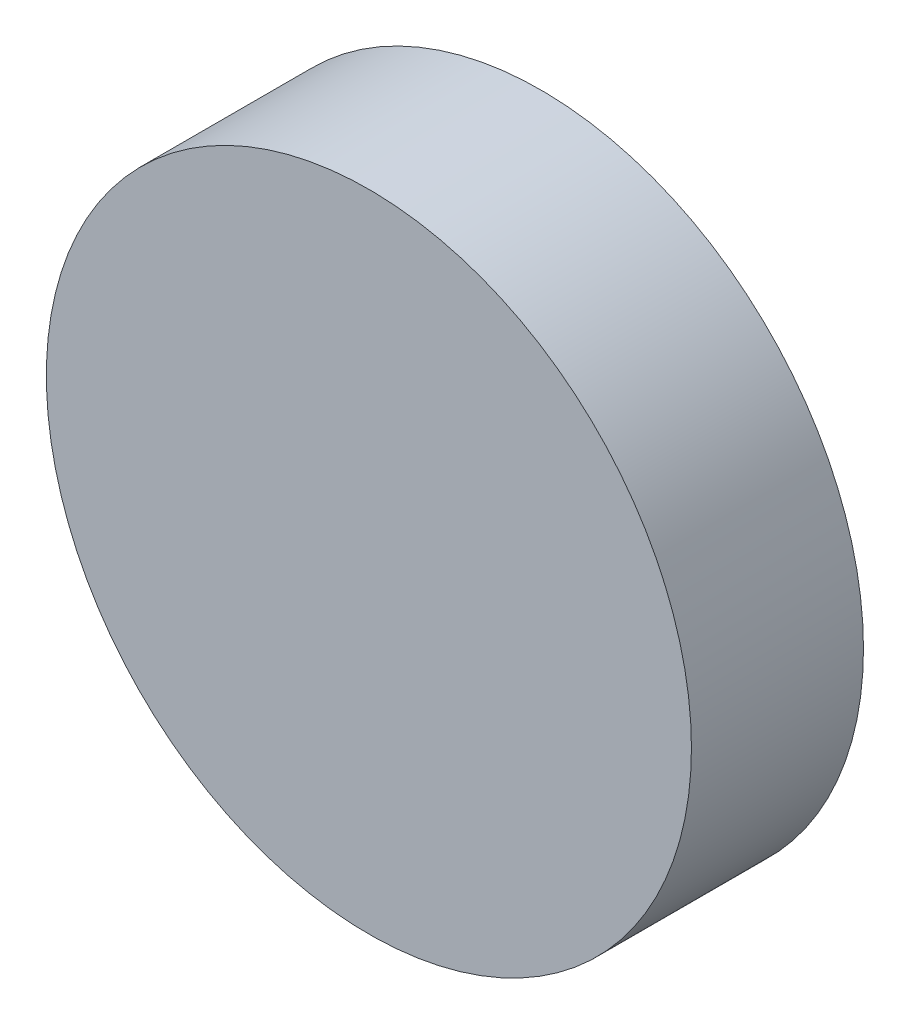
ISO-10303-21;
HEADER;
FILE_DESCRIPTION(('STEP AP214'),'2;1');
FILE_NAME('part.step','',(''),(''),'','','');
FILE_SCHEMA(('AUTOMOTIVE_DESIGN { 1 0 10303 214 1 1 1 1 }'));
ENDSEC;
DATA;
#1=APPLICATION_CONTEXT('core data for automotive mechanical design processes');
#2=APPLICATION_PROTOCOL_DEFINITION('international standard','automotive_design',2000,#1);
#3=PRODUCT_CONTEXT('',#1,'mechanical');
#4=PRODUCT('Part','Part','',(#3));
#5=PRODUCT_RELATED_PRODUCT_CATEGORY('part','',(#4));
#6=PRODUCT_DEFINITION_FORMATION('','',#4);
#7=PRODUCT_DEFINITION_CONTEXT('part definition',#1,'design');
#8=PRODUCT_DEFINITION('design','',#6,#7);
#9=PRODUCT_DEFINITION_SHAPE('','',#8);
#10=(LENGTH_UNIT() NAMED_UNIT(*) SI_UNIT(.MILLI.,.METRE.));
#11=(NAMED_UNIT(*) PLANE_ANGLE_UNIT() SI_UNIT($,.RADIAN.));
#12=(NAMED_UNIT(*) SI_UNIT($,.STERADIAN.) SOLID_ANGLE_UNIT());
#13=UNCERTAINTY_MEASURE_WITH_UNIT(LENGTH_MEASURE(1.E-05),#10,'distance_accuracy_value','');
#14=(GEOMETRIC_REPRESENTATION_CONTEXT(3) GLOBAL_UNCERTAINTY_ASSIGNED_CONTEXT((#13)) GLOBAL_UNIT_ASSIGNED_CONTEXT((#10,
#11,#12)) REPRESENTATION_CONTEXT('',''));
#15=CARTESIAN_POINT('',(0.,0.,0.));
#16=DIRECTION('',(0.,0.,1.));
#17=DIRECTION('',(1.,0.,0.));
#18=AXIS2_PLACEMENT_3D('',#15,#16,#17);
#19=CARTESIAN_POINT('',(0.,0.,8.));
#20=DIRECTION('',(0.,0.,-1.));
#21=DIRECTION('',(-1.,0.,0.));
#22=AXIS2_PLACEMENT_3D('',#19,#20,#21);
#23=CYLINDRICAL_SURFACE('',#22,15.);
#24=CARTESIAN_POINT('',(0.,0.,8.));
#25=DIRECTION('',(0.,0.,1.));
#26=DIRECTION('',(1.,0.,0.));
#27=AXIS2_PLACEMENT_3D('',#24,#25,#26);
#28=CIRCLE('',#27,15.);
#29=CARTESIAN_POINT('',(15.,0.,8.));
#30=VERTEX_POINT('',#29);
#31=EDGE_CURVE('E11',#30,#30,#28,.T.);
#32=ORIENTED_EDGE('',*,*,#31,.F.);
#33=EDGE_LOOP('',(#32));
#34=FACE_BOUND('',#33,.T.);
#35=CARTESIAN_POINT('',(0.,0.,0.));
#36=DIRECTION('',(0.,0.,1.));
#37=DIRECTION('',(1.,0.,0.));
#38=AXIS2_PLACEMENT_3D('',#35,#36,#37);
#39=CIRCLE('',#38,15.);
#40=CARTESIAN_POINT('',(15.,0.,0.));
#41=VERTEX_POINT('',#40);
#42=EDGE_CURVE('E36',#41,#41,#39,.T.);
#43=ORIENTED_EDGE('',*,*,#42,.T.);
#44=EDGE_LOOP('',(#43));
#45=FACE_BOUND('',#44,.T.);
#46=ADVANCED_FACE('F33',(#34,#45),#23,.T.);
#47=CARTESIAN_POINT('',(0.,0.,8.));
#48=DIRECTION('',(0.,0.,1.));
#49=DIRECTION('',(1.,0.,0.));
#50=AXIS2_PLACEMENT_3D('',#47,#48,#49);
#51=PLANE('',#50);
#52=ORIENTED_EDGE('',*,*,#31,.T.);
#53=EDGE_LOOP('',(#52));
#54=FACE_BOUND('',#53,.T.);
#55=ADVANCED_FACE('F58',(#54),#51,.T.);
#56=CARTESIAN_POINT('',(0.,0.,0.));
#57=DIRECTION('',(0.,0.,1.));
#58=DIRECTION('',(1.,0.,0.));
#59=AXIS2_PLACEMENT_3D('',#56,#57,#58);
#60=PLANE('',#59);
#61=CARTESIAN_POINT('',(0.,0.,0.));
#62=DIRECTION('',(0.,0.,-1.));
#63=DIRECTION('',(-1.,0.,0.));
#64=AXIS2_PLACEMENT_3D('',#61,#62,#63);
#65=CIRCLE('',#64,3.);
#66=CARTESIAN_POINT('',(-3.,0.,0.));
#67=VERTEX_POINT('',#66);
#68=EDGE_CURVE('E47',#67,#67,#65,.T.);
#69=ORIENTED_EDGE('',*,*,#68,.F.);
#70=EDGE_LOOP('',(#69));
#71=FACE_BOUND('',#70,.T.);
#72=ORIENTED_EDGE('',*,*,#42,.F.);
#73=EDGE_LOOP('',(#72));
#74=FACE_BOUND('',#73,.T.);
#75=ADVANCED_FACE('F54',(#71,#74),#60,.F.);
#76=CARTESIAN_POINT('',(0.,0.,7.8));
#77=DIRECTION('',(0.,0.,1.));
#78=DIRECTION('',(1.,0.,0.));
#79=AXIS2_PLACEMENT_3D('',#76,#77,#78);
#80=PLANE('',#79);
#81=CARTESIAN_POINT('',(0.,0.,7.8));
#82=DIRECTION('',(0.,0.,1.));
#83=DIRECTION('',(1.,0.,0.));
#84=AXIS2_PLACEMENT_3D('',#81,#82,#83);
#85=CIRCLE('',#84,3.);
#86=CARTESIAN_POINT('',(3.,0.,7.8));
#87=VERTEX_POINT('',#86);
#88=EDGE_CURVE('E43',#87,#87,#85,.F.);
#89=ORIENTED_EDGE('',*,*,#88,.T.);
#90=EDGE_LOOP('',(#89));
#91=FACE_BOUND('',#90,.T.);
#92=ADVANCED_FACE('F57',(#91),#80,.F.);
#93=CARTESIAN_POINT('',(0.,0.,16.4852813742386));
#94=DIRECTION('',(0.,0.,-1.));
#95=DIRECTION('',(-1.,0.,0.));
#96=AXIS2_PLACEMENT_3D('',#93,#94,#95);
#97=CYLINDRICAL_SURFACE('',#96,3.);
#98=ORIENTED_EDGE('',*,*,#68,.T.);
#99=EDGE_LOOP('',(#98));
#100=FACE_BOUND('',#99,.T.);
#101=ORIENTED_EDGE('',*,*,#88,.F.);
#102=EDGE_LOOP('',(#101));
#103=FACE_BOUND('',#102,.T.);
#104=ADVANCED_FACE('F51',(#100,#103),#97,.F.);
#105=CLOSED_SHELL('',(#46,#55,#75,#92,#104));
#106=MANIFOLD_SOLID_BREP('B2',#105);
#107=ADVANCED_BREP_SHAPE_REPRESENTATION('',(#18,#106),#14);
#108=SHAPE_DEFINITION_REPRESENTATION(#9,#107);
ENDSEC;
END-ISO-10303-21;
